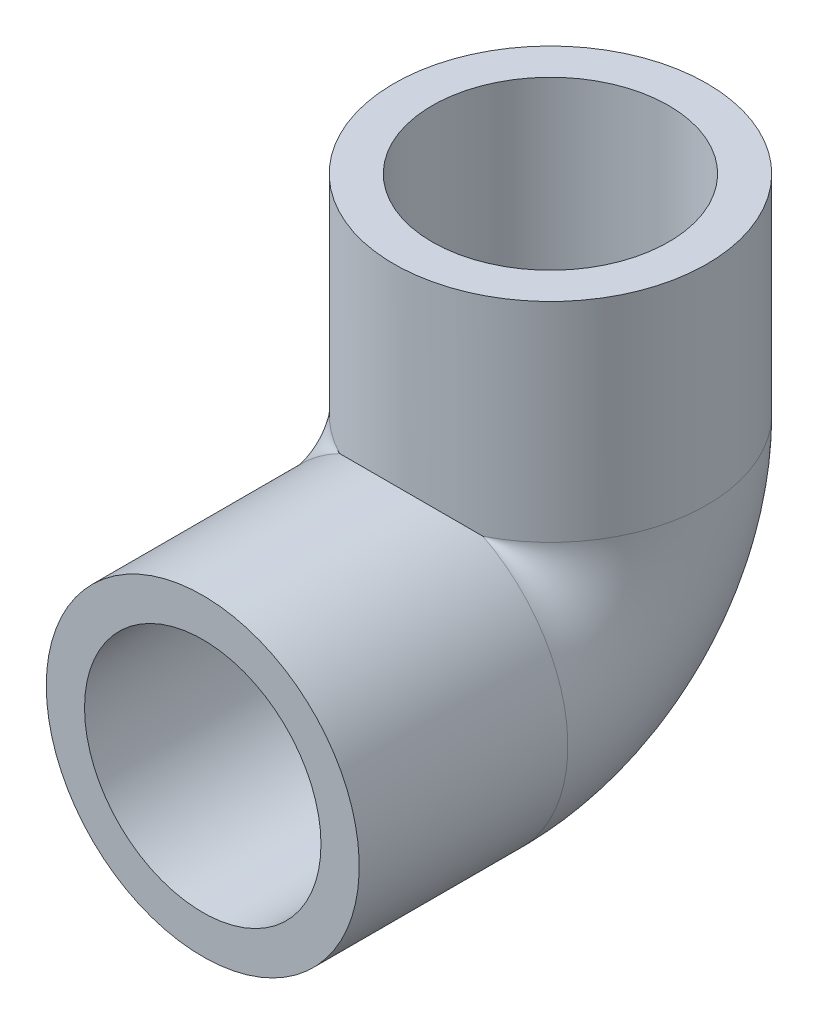
ISO-10303-21;
HEADER;
FILE_DESCRIPTION(('STEP AP214'),'2;1');
FILE_NAME('part.step','',(''),(''),'','','');
FILE_SCHEMA(('AUTOMOTIVE_DESIGN { 1 0 10303 214 1 1 1 1 }'));
ENDSEC;
DATA;
#1=APPLICATION_CONTEXT('core data for automotive mechanical design processes');
#2=APPLICATION_PROTOCOL_DEFINITION('international standard','automotive_design',2000,#1);
#3=PRODUCT_CONTEXT('',#1,'mechanical');
#4=PRODUCT('Part','Part','',(#3));
#5=PRODUCT_RELATED_PRODUCT_CATEGORY('part','',(#4));
#6=PRODUCT_DEFINITION_FORMATION('','',#4);
#7=PRODUCT_DEFINITION_CONTEXT('part definition',#1,'design');
#8=PRODUCT_DEFINITION('design','',#6,#7);
#9=PRODUCT_DEFINITION_SHAPE('','',#8);
#10=(LENGTH_UNIT() NAMED_UNIT(*) SI_UNIT(.MILLI.,.METRE.));
#11=(NAMED_UNIT(*) PLANE_ANGLE_UNIT() SI_UNIT($,.RADIAN.));
#12=(NAMED_UNIT(*) SI_UNIT($,.STERADIAN.) SOLID_ANGLE_UNIT());
#13=UNCERTAINTY_MEASURE_WITH_UNIT(LENGTH_MEASURE(1.E-05),#10,'distance_accuracy_value','');
#14=(GEOMETRIC_REPRESENTATION_CONTEXT(3) GLOBAL_UNCERTAINTY_ASSIGNED_CONTEXT((#13)) GLOBAL_UNIT_ASSIGNED_CONTEXT((#10,
#11,#12)) REPRESENTATION_CONTEXT('',''));
#15=CARTESIAN_POINT('',(0.,0.,0.));
#16=DIRECTION('',(0.,0.,1.));
#17=DIRECTION('',(1.,0.,0.));
#18=AXIS2_PLACEMENT_3D('',#15,#16,#17);
#19=CARTESIAN_POINT('',(0.,10.795,31.75));
#20=DIRECTION('',(0.,0.,1.));
#21=DIRECTION('',(1.,0.,0.));
#22=AXIS2_PLACEMENT_3D('',#19,#20,#21);
#23=PLANE('',#22);
#24=CARTESIAN_POINT('',(0.,0.,31.75));
#25=DIRECTION('',(0.,0.,-1.));
#26=DIRECTION('',(-1.,0.,0.));
#27=AXIS2_PLACEMENT_3D('',#24,#25,#26);
#28=CIRCLE('',#27,10.795);
#29=CARTESIAN_POINT('',(-10.795,0.,31.75));
#30=VERTEX_POINT('',#29);
#31=EDGE_CURVE('E84',#30,#30,#28,.T.);
#32=ORIENTED_EDGE('',*,*,#31,.T.);
#33=EDGE_LOOP('',(#32));
#34=FACE_BOUND('',#33,.T.);
#35=CARTESIAN_POINT('',(0.,0.,31.75));
#36=DIRECTION('',(0.,0.,-1.));
#37=DIRECTION('',(-1.,0.,0.));
#38=AXIS2_PLACEMENT_3D('',#35,#36,#37);
#39=CIRCLE('',#38,14.2875);
#40=CARTESIAN_POINT('',(-14.2875,0.,31.75));
#41=VERTEX_POINT('',#40);
#42=EDGE_CURVE('E11',#41,#41,#39,.T.);
#43=ORIENTED_EDGE('',*,*,#42,.F.);
#44=EDGE_LOOP('',(#43));
#45=FACE_BOUND('',#44,.T.);
#46=ADVANCED_FACE('F34',(#34,#45),#23,.T.);
#47=CARTESIAN_POINT('',(0.,0.,0.));
#48=DIRECTION('',(0.,0.,-1.));
#49=DIRECTION('',(-1.,0.,0.));
#50=AXIS2_PLACEMENT_3D('',#47,#48,#49);
#51=CYLINDRICAL_SURFACE('',#50,14.2875);
#52=CARTESIAN_POINT('',(0.,0.,0.));
#53=DIRECTION('',(0.,0.707106781186547,-0.707106781186547));
#54=DIRECTION('',(0.,-0.707106781186547,-0.707106781186547));
#55=AXIS2_PLACEMENT_3D('',#52,#53,#54);
#56=ELLIPSE('',#55,20.2055762724056,14.2875);
#57=CARTESIAN_POINT('',(-6.54543018066795,12.7,12.7000000000001));
#58=VERTEX_POINT('',#57);
#59=CARTESIAN_POINT('',(6.54543018066806,12.7,12.7000000000001));
#60=VERTEX_POINT('',#59);
#61=EDGE_CURVE('E86',#58,#60,#56,.T.);
#62=ORIENTED_EDGE('',*,*,#61,.F.);
#63=CARTESIAN_POINT('',(0.,0.,12.7000000000001));
#64=DIRECTION('',(0.,0.,-1.));
#65=DIRECTION('',(-1.,0.,0.));
#66=AXIS2_PLACEMENT_3D('',#63,#64,#65);
#67=CIRCLE('',#66,14.2875);
#68=EDGE_CURVE('E37',#60,#58,#67,.T.);
#69=ORIENTED_EDGE('',*,*,#68,.F.);
#70=EDGE_LOOP('',(#62,#69));
#71=FACE_BOUND('',#70,.T.);
#72=ORIENTED_EDGE('',*,*,#42,.T.);
#73=EDGE_LOOP('',(#72));
#74=FACE_BOUND('',#73,.T.);
#75=ADVANCED_FACE('F105',(#71,#74),#51,.T.);
#76=CARTESIAN_POINT('',(0.,0.,0.));
#77=DIRECTION('',(0.,0.,-1.));
#78=DIRECTION('',(-1.,0.,0.));
#79=AXIS2_PLACEMENT_3D('',#76,#77,#78);
#80=CYLINDRICAL_SURFACE('',#79,10.795);
#81=CARTESIAN_POINT('',(0.,0.,12.7000000000001));
#82=DIRECTION('',(0.,0.,-1.));
#83=DIRECTION('',(-1.,0.,0.));
#84=AXIS2_PLACEMENT_3D('',#81,#82,#83);
#85=CIRCLE('',#84,10.795);
#86=CARTESIAN_POINT('',(-10.795,0.,12.7000000000001));
#87=VERTEX_POINT('',#86);
#88=EDGE_CURVE('E64',#87,#87,#85,.T.);
#89=ORIENTED_EDGE('',*,*,#88,.T.);
#90=EDGE_LOOP('',(#89));
#91=FACE_BOUND('',#90,.T.);
#92=ORIENTED_EDGE('',*,*,#31,.F.);
#93=EDGE_LOOP('',(#92));
#94=FACE_BOUND('',#93,.T.);
#95=ADVANCED_FACE('F96',(#91,#94),#80,.F.);
#96=CARTESIAN_POINT('',(0.,31.75,-10.795));
#97=DIRECTION('',(0.,1.,0.));
#98=DIRECTION('',(0.,0.,1.));
#99=AXIS2_PLACEMENT_3D('',#96,#97,#98);
#100=PLANE('',#99);
#101=CARTESIAN_POINT('',(0.,31.75,0.));
#102=DIRECTION('',(0.,-1.,0.));
#103=DIRECTION('',(0.,0.,-1.));
#104=AXIS2_PLACEMENT_3D('',#101,#102,#103);
#105=CIRCLE('',#104,10.795);
#106=CARTESIAN_POINT('',(0.,31.75,-10.795));
#107=VERTEX_POINT('',#106);
#108=EDGE_CURVE('E73',#107,#107,#105,.T.);
#109=ORIENTED_EDGE('',*,*,#108,.T.);
#110=EDGE_LOOP('',(#109));
#111=FACE_BOUND('',#110,.T.);
#112=CARTESIAN_POINT('',(0.,31.75,0.));
#113=DIRECTION('',(0.,-1.,0.));
#114=DIRECTION('',(0.,0.,-1.));
#115=AXIS2_PLACEMENT_3D('',#112,#113,#114);
#116=CIRCLE('',#115,14.2875);
#117=CARTESIAN_POINT('',(0.,31.75,-14.2875));
#118=VERTEX_POINT('',#117);
#119=EDGE_CURVE('E80',#118,#118,#116,.T.);
#120=ORIENTED_EDGE('',*,*,#119,.F.);
#121=EDGE_LOOP('',(#120));
#122=FACE_BOUND('',#121,.T.);
#123=ADVANCED_FACE('F94',(#111,#122),#100,.T.);
#124=CARTESIAN_POINT('',(0.,0.,0.));
#125=DIRECTION('',(0.,-1.,0.));
#126=DIRECTION('',(0.,0.,-1.));
#127=AXIS2_PLACEMENT_3D('',#124,#125,#126);
#128=CYLINDRICAL_SURFACE('',#127,14.2875);
#129=ORIENTED_EDGE('',*,*,#119,.T.);
#130=EDGE_LOOP('',(#129));
#131=FACE_BOUND('',#130,.T.);
#132=CARTESIAN_POINT('',(0.,12.7,0.));
#133=DIRECTION('',(0.,-1.,0.));
#134=DIRECTION('',(0.,0.,-1.));
#135=AXIS2_PLACEMENT_3D('',#132,#133,#134);
#136=CIRCLE('',#135,14.2875);
#137=EDGE_CURVE('E49',#58,#60,#136,.T.);
#138=ORIENTED_EDGE('',*,*,#137,.F.);
#139=ORIENTED_EDGE('',*,*,#61,.T.);
#140=EDGE_LOOP('',(#138,#139));
#141=FACE_BOUND('',#140,.T.);
#142=ADVANCED_FACE('F92',(#131,#141),#128,.T.);
#143=CARTESIAN_POINT('',(0.,0.,0.));
#144=DIRECTION('',(0.,-1.,0.));
#145=DIRECTION('',(0.,0.,-1.));
#146=AXIS2_PLACEMENT_3D('',#143,#144,#145);
#147=CYLINDRICAL_SURFACE('',#146,10.795);
#148=CARTESIAN_POINT('',(0.,12.7,0.));
#149=DIRECTION('',(0.,-1.,0.));
#150=DIRECTION('',(0.,0.,-1.));
#151=AXIS2_PLACEMENT_3D('',#148,#149,#150);
#152=CIRCLE('',#151,10.795);
#153=CARTESIAN_POINT('',(0.,12.7,-10.795));
#154=VERTEX_POINT('',#153);
#155=EDGE_CURVE('E68',#154,#154,#152,.T.);
#156=ORIENTED_EDGE('',*,*,#155,.T.);
#157=EDGE_LOOP('',(#156));
#158=FACE_BOUND('',#157,.T.);
#159=ORIENTED_EDGE('',*,*,#108,.F.);
#160=EDGE_LOOP('',(#159));
#161=FACE_BOUND('',#160,.T.);
#162=ADVANCED_FACE('F103',(#158,#161),#147,.F.);
#163=CARTESIAN_POINT('',(0.,12.7000000000001,12.7000000000001));
#164=DIRECTION('',(1.,0.,0.));
#165=DIRECTION('',(0.,0.,-1.));
#166=AXIS2_PLACEMENT_3D('',#163,#164,#165);
#167=TOROIDAL_SURFACE('',#166,12.7000000000001,7.72160000000004);
#168=CARTESIAN_POINT('',(0.,12.7000000000001,0.));
#169=DIRECTION('',(0.,1.,0.));
#170=DIRECTION('',(0.,0.,1.));
#171=AXIS2_PLACEMENT_3D('',#168,#169,#170);
#172=CIRCLE('',#171,7.72160000000004);
#173=CARTESIAN_POINT('',(0.,12.7000000000001,7.72160000000004));
#174=VERTEX_POINT('',#173);
#175=EDGE_CURVE('E60',#174,#174,#172,.F.);
#176=ORIENTED_EDGE('',*,*,#175,.F.);
#177=EDGE_LOOP('',(#176));
#178=FACE_BOUND('',#177,.T.);
#179=CARTESIAN_POINT('',(0.,0.,12.7000000000001));
#180=DIRECTION('',(0.,0.,-1.));
#181=DIRECTION('',(0.,1.,0.));
#182=AXIS2_PLACEMENT_3D('',#179,#180,#181);
#183=CIRCLE('',#182,7.72160000000004);
#184=CARTESIAN_POINT('',(0.,7.72160000000004,12.7000000000001));
#185=VERTEX_POINT('',#184);
#186=EDGE_CURVE('E65',#185,#185,#183,.F.);
#187=ORIENTED_EDGE('',*,*,#186,.T.);
#188=EDGE_LOOP('',(#187));
#189=FACE_BOUND('',#188,.T.);
#190=ADVANCED_FACE('F141',(#178,#189),#167,.F.);
#191=CARTESIAN_POINT('',(0.,0.,12.7000000000001));
#192=DIRECTION('',(0.,0.,-1.));
#193=DIRECTION('',(0.,1.,0.));
#194=AXIS2_PLACEMENT_3D('',#191,#192,#193);
#195=PLANE('',#194);
#196=ORIENTED_EDGE('',*,*,#88,.F.);
#197=EDGE_LOOP('',(#196));
#198=FACE_BOUND('',#197,.T.);
#199=ORIENTED_EDGE('',*,*,#186,.F.);
#200=EDGE_LOOP('',(#199));
#201=FACE_BOUND('',#200,.T.);
#202=ADVANCED_FACE('F153',(#198,#201),#195,.F.);
#203=CARTESIAN_POINT('',(0.,12.7000000000001,0.));
#204=DIRECTION('',(0.,1.,0.));
#205=DIRECTION('',(0.,0.,1.));
#206=AXIS2_PLACEMENT_3D('',#203,#204,#205);
#207=PLANE('',#206);
#208=ORIENTED_EDGE('',*,*,#175,.T.);
#209=EDGE_LOOP('',(#208));
#210=FACE_BOUND('',#209,.T.);
#211=ORIENTED_EDGE('',*,*,#155,.F.);
#212=EDGE_LOOP('',(#211));
#213=FACE_BOUND('',#212,.T.);
#214=ADVANCED_FACE('F61',(#210,#213),#207,.T.);
#215=CARTESIAN_POINT('',(0.,12.7000000000001,0.));
#216=DIRECTION('',(0.,-1.,0.));
#217=DIRECTION('',(0.,0.,-1.));
#218=AXIS2_PLACEMENT_3D('',#215,#216,#217);
#219=CIRCLE('',#218,14.2875);
#220=TRIMMED_CURVE('',#219,(PARAMETER_VALUE(-2.66571040392939)),
(PARAMETER_VALUE(2.66571040392939)),.T.,.PARAMETER.);
#221=CARTESIAN_POINT('',(0.,12.7000000000001,12.7000000000001));
#222=DIRECTION('',(1.,0.,0.));
#223=AXIS1_PLACEMENT('',#221,#222);
#224=SURFACE_OF_REVOLUTION('',#220,#223);
#225=ORIENTED_EDGE('',*,*,#68,.T.);
#226=ORIENTED_EDGE('',*,*,#137,.T.);
#227=EDGE_LOOP('',(#225,#226));
#228=FACE_BOUND('',#227,.T.);
#229=ADVANCED_FACE('F166',(#228),#224,.T.);
#230=CLOSED_SHELL('',(#46,#75,#95,#123,#142,#162,#190,#202,#214,#229));
#231=MANIFOLD_SOLID_BREP('B2',#230);
#232=ADVANCED_BREP_SHAPE_REPRESENTATION('',(#18,#231),#14);
#233=SHAPE_DEFINITION_REPRESENTATION(#9,#232);
ENDSEC;
END-ISO-10303-21;
